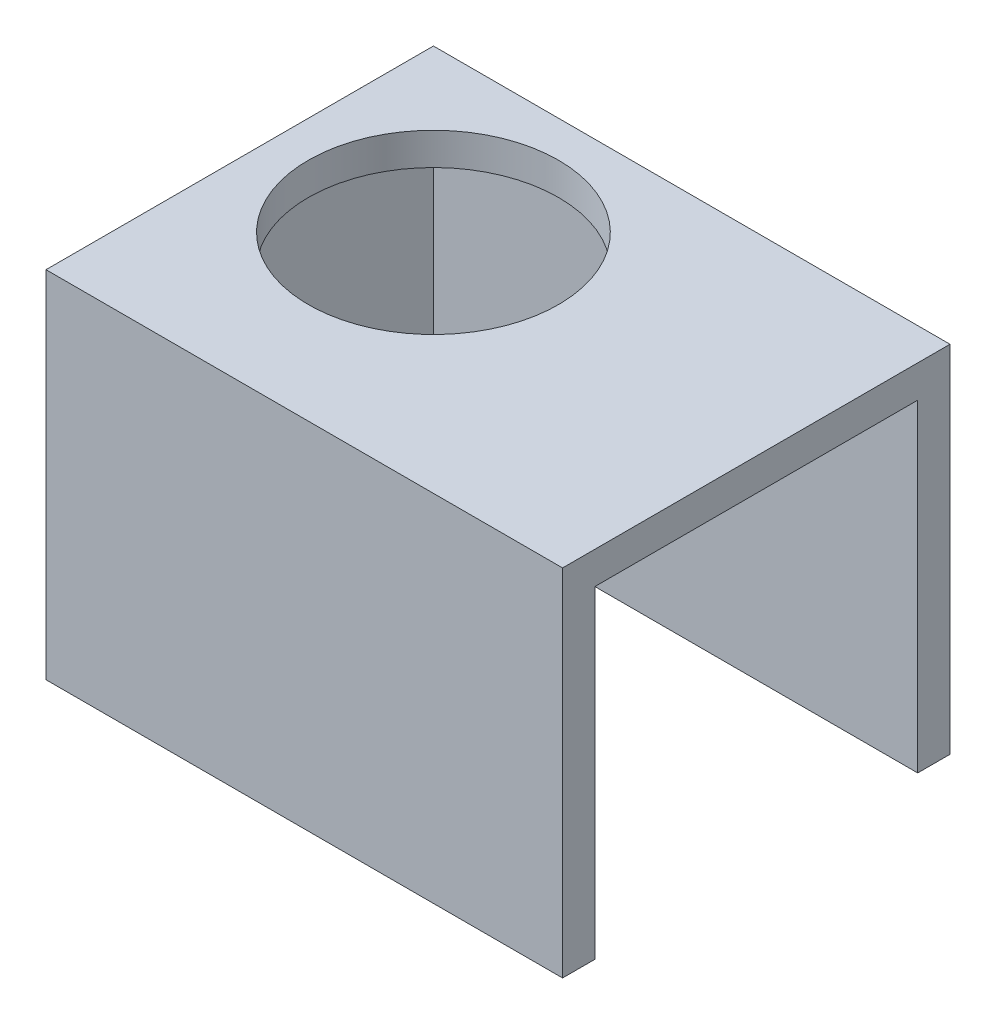
ISO-10303-21;
HEADER;
FILE_DESCRIPTION(('STEP AP214'),'2;1');
FILE_NAME('part.step','',(''),(''),'','','');
FILE_SCHEMA(('AUTOMOTIVE_DESIGN { 1 0 10303 214 1 1 1 1 }'));
ENDSEC;
DATA;
#1=APPLICATION_CONTEXT('core data for automotive mechanical design processes');
#2=APPLICATION_PROTOCOL_DEFINITION('international standard','automotive_design',2000,#1);
#3=PRODUCT_CONTEXT('',#1,'mechanical');
#4=PRODUCT('Part','Part','',(#3));
#5=PRODUCT_RELATED_PRODUCT_CATEGORY('part','',(#4));
#6=PRODUCT_DEFINITION_FORMATION('','',#4);
#7=PRODUCT_DEFINITION_CONTEXT('part definition',#1,'design');
#8=PRODUCT_DEFINITION('design','',#6,#7);
#9=PRODUCT_DEFINITION_SHAPE('','',#8);
#10=(LENGTH_UNIT() NAMED_UNIT(*) SI_UNIT(.MILLI.,.METRE.));
#11=(NAMED_UNIT(*) PLANE_ANGLE_UNIT() SI_UNIT($,.RADIAN.));
#12=(NAMED_UNIT(*) SI_UNIT($,.STERADIAN.) SOLID_ANGLE_UNIT());
#13=UNCERTAINTY_MEASURE_WITH_UNIT(LENGTH_MEASURE(1.E-05),#10,'distance_accuracy_value','');
#14=(GEOMETRIC_REPRESENTATION_CONTEXT(3) GLOBAL_UNCERTAINTY_ASSIGNED_CONTEXT((#13)) GLOBAL_UNIT_ASSIGNED_CONTEXT((#10,
#11,#12)) REPRESENTATION_CONTEXT('',''));
#15=CARTESIAN_POINT('',(0.,0.,0.));
#16=DIRECTION('',(0.,0.,1.));
#17=DIRECTION('',(1.,0.,0.));
#18=AXIS2_PLACEMENT_3D('',#15,#16,#17);
#19=CARTESIAN_POINT('',(16.,24.,12.));
#20=DIRECTION('',(-1.,0.,0.));
#21=DIRECTION('',(0.,0.,1.));
#22=AXIS2_PLACEMENT_3D('',#19,#20,#21);
#23=PLANE('',#22);
#24=DIRECTION('',(0.,0.,1.));
#25=VECTOR('',#24,1.);
#26=CARTESIAN_POINT('',(16.,2.,12.));
#27=LINE('',#26,#25);
#28=CARTESIAN_POINT('',(16.,2.,-12.));
#29=VERTEX_POINT('',#28);
#30=CARTESIAN_POINT('',(16.,2.,-10.));
#31=VERTEX_POINT('',#30);
#32=EDGE_CURVE('E113',#29,#31,#27,.T.);
#33=ORIENTED_EDGE('',*,*,#32,.F.);
#34=DIRECTION('',(0.,-1.,0.));
#35=VECTOR('',#34,1.);
#36=CARTESIAN_POINT('',(16.,24.,-12.));
#37=LINE('',#36,#35);
#38=CARTESIAN_POINT('',(16.,24.,-12.));
#39=VERTEX_POINT('',#38);
#40=EDGE_CURVE('E11',#39,#29,#37,.T.);
#41=ORIENTED_EDGE('',*,*,#40,.F.);
#42=DIRECTION('',(0.,0.,-1.));
#43=VECTOR('',#42,1.);
#44=CARTESIAN_POINT('',(16.,24.,12.));
#45=LINE('',#44,#43);
#46=CARTESIAN_POINT('',(16.,24.,12.));
#47=VERTEX_POINT('',#46);
#48=EDGE_CURVE('E126',#47,#39,#45,.T.);
#49=ORIENTED_EDGE('',*,*,#48,.F.);
#50=DIRECTION('',(0.,-1.,0.));
#51=VECTOR('',#50,1.);
#52=CARTESIAN_POINT('',(16.,24.,12.));
#53=LINE('',#52,#51);
#54=CARTESIAN_POINT('',(16.,2.,12.));
#55=VERTEX_POINT('',#54);
#56=EDGE_CURVE('E118',#47,#55,#53,.T.);
#57=ORIENTED_EDGE('',*,*,#56,.T.);
#58=CARTESIAN_POINT('',(16.,2.,10.));
#59=VERTEX_POINT('',#58);
#60=EDGE_CURVE('E102',#59,#55,#27,.T.);
#61=ORIENTED_EDGE('',*,*,#60,.F.);
#62=DIRECTION('',(0.,-1.,0.));
#63=VECTOR('',#62,1.);
#64=CARTESIAN_POINT('',(16.,24.,10.));
#65=LINE('',#64,#63);
#66=CARTESIAN_POINT('',(16.,22.,10.));
#67=VERTEX_POINT('',#66);
#68=EDGE_CURVE('E165',#67,#59,#65,.T.);
#69=ORIENTED_EDGE('',*,*,#68,.F.);
#70=DIRECTION('',(0.,0.,-1.));
#71=VECTOR('',#70,1.);
#72=CARTESIAN_POINT('',(16.,22.,0.));
#73=LINE('',#72,#71);
#74=CARTESIAN_POINT('',(16.,22.,-10.));
#75=VERTEX_POINT('',#74);
#76=EDGE_CURVE('E51',#67,#75,#73,.T.);
#77=ORIENTED_EDGE('',*,*,#76,.T.);
#78=DIRECTION('',(0.,-1.,0.));
#79=VECTOR('',#78,1.);
#80=CARTESIAN_POINT('',(16.,24.,-10.));
#81=LINE('',#80,#79);
#82=EDGE_CURVE('E157',#75,#31,#81,.T.);
#83=ORIENTED_EDGE('',*,*,#82,.T.);
#84=EDGE_LOOP('',(#33,#41,#49,#57,#61,#69,#77,#83));
#85=FACE_BOUND('',#84,.T.);
#86=ADVANCED_FACE('F37',(#85),#23,.F.);
#87=CARTESIAN_POINT('',(-16.,24.,-12.));
#88=DIRECTION('',(0.,0.,1.));
#89=DIRECTION('',(1.,0.,0.));
#90=AXIS2_PLACEMENT_3D('',#87,#88,#89);
#91=PLANE('',#90);
#92=DIRECTION('',(1.,0.,0.));
#93=VECTOR('',#92,1.);
#94=CARTESIAN_POINT('',(-16.,2.,-12.));
#95=LINE('',#94,#93);
#96=CARTESIAN_POINT('',(-16.,2.,-12.));
#97=VERTEX_POINT('',#96);
#98=EDGE_CURVE('E141',#97,#29,#95,.T.);
#99=ORIENTED_EDGE('',*,*,#98,.F.);
#100=DIRECTION('',(0.,-1.,0.));
#101=VECTOR('',#100,1.);
#102=CARTESIAN_POINT('',(-16.,24.,-12.));
#103=LINE('',#102,#101);
#104=CARTESIAN_POINT('',(-16.,24.,-12.));
#105=VERTEX_POINT('',#104);
#106=EDGE_CURVE('E44',#105,#97,#103,.T.);
#107=ORIENTED_EDGE('',*,*,#106,.F.);
#108=DIRECTION('',(-1.,0.,0.));
#109=VECTOR('',#108,1.);
#110=CARTESIAN_POINT('',(-16.,24.,-12.));
#111=LINE('',#110,#109);
#112=EDGE_CURVE('E140',#39,#105,#111,.T.);
#113=ORIENTED_EDGE('',*,*,#112,.F.);
#114=ORIENTED_EDGE('',*,*,#40,.T.);
#115=EDGE_LOOP('',(#99,#107,#113,#114));
#116=FACE_BOUND('',#115,.T.);
#117=ADVANCED_FACE('F139',(#116),#91,.F.);
#118=CARTESIAN_POINT('',(-16.,24.,12.));
#119=DIRECTION('',(1.,0.,0.));
#120=DIRECTION('',(0.,0.,-1.));
#121=AXIS2_PLACEMENT_3D('',#118,#119,#120);
#122=PLANE('',#121);
#123=DIRECTION('',(0.,0.,-1.));
#124=VECTOR('',#123,1.);
#125=CARTESIAN_POINT('',(-16.,2.,12.));
#126=LINE('',#125,#124);
#127=CARTESIAN_POINT('',(-16.,2.,12.));
#128=VERTEX_POINT('',#127);
#129=EDGE_CURVE('E122',#128,#97,#126,.T.);
#130=ORIENTED_EDGE('',*,*,#129,.F.);
#131=DIRECTION('',(0.,-1.,0.));
#132=VECTOR('',#131,1.);
#133=CARTESIAN_POINT('',(-16.,24.,12.));
#134=LINE('',#133,#132);
#135=CARTESIAN_POINT('',(-16.,24.,12.));
#136=VERTEX_POINT('',#135);
#137=EDGE_CURVE('E121',#136,#128,#134,.T.);
#138=ORIENTED_EDGE('',*,*,#137,.F.);
#139=DIRECTION('',(0.,0.,1.));
#140=VECTOR('',#139,1.);
#141=CARTESIAN_POINT('',(-16.,24.,12.));
#142=LINE('',#141,#140);
#143=EDGE_CURVE('E129',#105,#136,#142,.T.);
#144=ORIENTED_EDGE('',*,*,#143,.F.);
#145=ORIENTED_EDGE('',*,*,#106,.T.);
#146=EDGE_LOOP('',(#130,#138,#144,#145));
#147=FACE_BOUND('',#146,.T.);
#148=ADVANCED_FACE('F136',(#147),#122,.F.);
#149=CARTESIAN_POINT('',(-16.,24.,12.));
#150=DIRECTION('',(0.,0.,-1.));
#151=DIRECTION('',(-1.,0.,0.));
#152=AXIS2_PLACEMENT_3D('',#149,#150,#151);
#153=PLANE('',#152);
#154=DIRECTION('',(-1.,0.,0.));
#155=VECTOR('',#154,1.);
#156=CARTESIAN_POINT('',(-16.,2.,12.));
#157=LINE('',#156,#155);
#158=EDGE_CURVE('E105',#55,#128,#157,.T.);
#159=ORIENTED_EDGE('',*,*,#158,.F.);
#160=ORIENTED_EDGE('',*,*,#56,.F.);
#161=DIRECTION('',(1.,0.,0.));
#162=VECTOR('',#161,1.);
#163=CARTESIAN_POINT('',(-16.,24.,12.));
#164=LINE('',#163,#162);
#165=EDGE_CURVE('E59',#136,#47,#164,.T.);
#166=ORIENTED_EDGE('',*,*,#165,.F.);
#167=ORIENTED_EDGE('',*,*,#137,.T.);
#168=EDGE_LOOP('',(#159,#160,#166,#167));
#169=FACE_BOUND('',#168,.T.);
#170=ADVANCED_FACE('F117',(#169),#153,.F.);
#171=CARTESIAN_POINT('',(0.,24.,0.));
#172=DIRECTION('',(0.,-1.,0.));
#173=DIRECTION('',(0.,0.,-1.));
#174=AXIS2_PLACEMENT_3D('',#171,#172,#173);
#175=PLANE('',#174);
#176=CARTESIAN_POINT('',(-6.,24.,-2.));
#177=DIRECTION('',(0.,-1.,0.));
#178=DIRECTION('',(0.,0.,-1.));
#179=AXIS2_PLACEMENT_3D('',#176,#177,#178);
#180=CIRCLE('',#179,7.75000000000001);
#181=CARTESIAN_POINT('',(-6.,24.,-9.75000000000001));
#182=VERTEX_POINT('',#181);
#183=EDGE_CURVE('E145',#182,#182,#180,.T.);
#184=ORIENTED_EDGE('',*,*,#183,.T.);
#185=EDGE_LOOP('',(#184));
#186=FACE_BOUND('',#185,.T.);
#187=ORIENTED_EDGE('',*,*,#48,.T.);
#188=ORIENTED_EDGE('',*,*,#112,.T.);
#189=ORIENTED_EDGE('',*,*,#143,.T.);
#190=ORIENTED_EDGE('',*,*,#165,.T.);
#191=EDGE_LOOP('',(#187,#188,#189,#190));
#192=FACE_BOUND('',#191,.T.);
#193=ADVANCED_FACE('F175',(#186,#192),#175,.F.);
#194=CARTESIAN_POINT('',(-16.,24.,-10.));
#195=DIRECTION('',(0.,0.,1.));
#196=DIRECTION('',(1.,0.,0.));
#197=AXIS2_PLACEMENT_3D('',#194,#195,#196);
#198=PLANE('',#197);
#199=DIRECTION('',(-1.,0.,0.));
#200=VECTOR('',#199,1.);
#201=CARTESIAN_POINT('',(0.,2.,-10.));
#202=LINE('',#201,#200);
#203=CARTESIAN_POINT('',(-14.,2.,-10.));
#204=VERTEX_POINT('',#203);
#205=EDGE_CURVE('E151',#31,#204,#202,.T.);
#206=ORIENTED_EDGE('',*,*,#205,.F.);
#207=ORIENTED_EDGE('',*,*,#82,.F.);
#208=DIRECTION('',(-1.,0.,0.));
#209=VECTOR('',#208,1.);
#210=CARTESIAN_POINT('',(0.,22.,-10.));
#211=LINE('',#210,#209);
#212=CARTESIAN_POINT('',(-14.,22.,-10.));
#213=VERTEX_POINT('',#212);
#214=EDGE_CURVE('E159',#75,#213,#211,.T.);
#215=ORIENTED_EDGE('',*,*,#214,.T.);
#216=DIRECTION('',(0.,-1.,0.));
#217=VECTOR('',#216,1.);
#218=CARTESIAN_POINT('',(-14.,24.,-10.));
#219=LINE('',#218,#217);
#220=EDGE_CURVE('E154',#213,#204,#219,.T.);
#221=ORIENTED_EDGE('',*,*,#220,.T.);
#222=EDGE_LOOP('',(#206,#207,#215,#221));
#223=FACE_BOUND('',#222,.T.);
#224=ADVANCED_FACE('F179',(#223),#198,.T.);
#225=CARTESIAN_POINT('',(-14.,24.,12.));
#226=DIRECTION('',(1.,0.,0.));
#227=DIRECTION('',(0.,0.,-1.));
#228=AXIS2_PLACEMENT_3D('',#225,#226,#227);
#229=PLANE('',#228);
#230=DIRECTION('',(0.,0.,1.));
#231=VECTOR('',#230,1.);
#232=CARTESIAN_POINT('',(-14.,2.,0.));
#233=LINE('',#232,#231);
#234=CARTESIAN_POINT('',(-14.,2.,10.));
#235=VERTEX_POINT('',#234);
#236=EDGE_CURVE('E153',#204,#235,#233,.T.);
#237=ORIENTED_EDGE('',*,*,#236,.F.);
#238=ORIENTED_EDGE('',*,*,#220,.F.);
#239=DIRECTION('',(0.,0.,1.));
#240=VECTOR('',#239,1.);
#241=CARTESIAN_POINT('',(-14.,22.,0.));
#242=LINE('',#241,#240);
#243=CARTESIAN_POINT('',(-14.,22.,10.));
#244=VERTEX_POINT('',#243);
#245=EDGE_CURVE('E161',#213,#244,#242,.T.);
#246=ORIENTED_EDGE('',*,*,#245,.T.);
#247=DIRECTION('',(0.,-1.,0.));
#248=VECTOR('',#247,1.);
#249=CARTESIAN_POINT('',(-14.,24.,10.));
#250=LINE('',#249,#248);
#251=EDGE_CURVE('E158',#244,#235,#250,.T.);
#252=ORIENTED_EDGE('',*,*,#251,.T.);
#253=EDGE_LOOP('',(#237,#238,#246,#252));
#254=FACE_BOUND('',#253,.T.);
#255=ADVANCED_FACE('F184',(#254),#229,.T.);
#256=CARTESIAN_POINT('',(-16.,24.,10.));
#257=DIRECTION('',(0.,0.,-1.));
#258=DIRECTION('',(-1.,0.,0.));
#259=AXIS2_PLACEMENT_3D('',#256,#257,#258);
#260=PLANE('',#259);
#261=DIRECTION('',(1.,0.,0.));
#262=VECTOR('',#261,1.);
#263=CARTESIAN_POINT('',(0.,2.,10.));
#264=LINE('',#263,#262);
#265=EDGE_CURVE('E108',#235,#59,#264,.T.);
#266=ORIENTED_EDGE('',*,*,#265,.F.);
#267=ORIENTED_EDGE('',*,*,#251,.F.);
#268=DIRECTION('',(1.,0.,0.));
#269=VECTOR('',#268,1.);
#270=CARTESIAN_POINT('',(0.,22.,10.));
#271=LINE('',#270,#269);
#272=EDGE_CURVE('E167',#244,#67,#271,.T.);
#273=ORIENTED_EDGE('',*,*,#272,.T.);
#274=ORIENTED_EDGE('',*,*,#68,.T.);
#275=EDGE_LOOP('',(#266,#267,#273,#274));
#276=FACE_BOUND('',#275,.T.);
#277=ADVANCED_FACE('F187',(#276),#260,.T.);
#278=CARTESIAN_POINT('',(0.,22.,0.));
#279=DIRECTION('',(0.,-1.,0.));
#280=DIRECTION('',(0.,0.,-1.));
#281=AXIS2_PLACEMENT_3D('',#278,#279,#280);
#282=PLANE('',#281);
#283=CARTESIAN_POINT('',(-6.,22.,-2.));
#284=DIRECTION('',(0.,-1.,0.));
#285=DIRECTION('',(0.,0.,-1.));
#286=AXIS2_PLACEMENT_3D('',#283,#284,#285);
#287=CIRCLE('',#286,7.75000000000001);
#288=CARTESIAN_POINT('',(-6.,22.,-9.75000000000001));
#289=VERTEX_POINT('',#288);
#290=EDGE_CURVE('E142',#289,#289,#287,.T.);
#291=ORIENTED_EDGE('',*,*,#290,.F.);
#292=EDGE_LOOP('',(#291));
#293=FACE_BOUND('',#292,.T.);
#294=ORIENTED_EDGE('',*,*,#76,.F.);
#295=ORIENTED_EDGE('',*,*,#272,.F.);
#296=ORIENTED_EDGE('',*,*,#245,.F.);
#297=ORIENTED_EDGE('',*,*,#214,.F.);
#298=EDGE_LOOP('',(#294,#295,#296,#297));
#299=FACE_BOUND('',#298,.T.);
#300=ADVANCED_FACE('F188',(#293,#299),#282,.T.);
#301=CARTESIAN_POINT('',(-6.,27.,-2.));
#302=DIRECTION('',(0.,-1.,0.));
#303=DIRECTION('',(0.,0.,-1.));
#304=AXIS2_PLACEMENT_3D('',#301,#302,#303);
#305=CYLINDRICAL_SURFACE('',#304,7.75000000000001);
#306=ORIENTED_EDGE('',*,*,#290,.T.);
#307=EDGE_LOOP('',(#306));
#308=FACE_BOUND('',#307,.T.);
#309=ORIENTED_EDGE('',*,*,#183,.F.);
#310=EDGE_LOOP('',(#309));
#311=FACE_BOUND('',#310,.T.);
#312=ADVANCED_FACE('F190',(#308,#311),#305,.F.);
#313=CARTESIAN_POINT('',(0.,2.,0.));
#314=DIRECTION('',(0.,-1.,0.));
#315=DIRECTION('',(0.,0.,-1.));
#316=AXIS2_PLACEMENT_3D('',#313,#314,#315);
#317=PLANE('',#316);
#318=ORIENTED_EDGE('',*,*,#236,.T.);
#319=ORIENTED_EDGE('',*,*,#265,.T.);
#320=ORIENTED_EDGE('',*,*,#60,.T.);
#321=ORIENTED_EDGE('',*,*,#158,.T.);
#322=ORIENTED_EDGE('',*,*,#129,.T.);
#323=ORIENTED_EDGE('',*,*,#98,.T.);
#324=ORIENTED_EDGE('',*,*,#32,.T.);
#325=ORIENTED_EDGE('',*,*,#205,.T.);
#326=EDGE_LOOP('',(#318,#319,#320,#321,#322,#323,#324,#325));
#327=FACE_BOUND('',#326,.T.);
#328=ADVANCED_FACE('F104',(#327),#317,.T.);
#329=CLOSED_SHELL('',(#86,#117,#148,#170,#193,#224,#255,#277,#300,#312,#328));
#330=MANIFOLD_SOLID_BREP('B2',#329);
#331=ADVANCED_BREP_SHAPE_REPRESENTATION('',(#18,#330),#14);
#332=SHAPE_DEFINITION_REPRESENTATION(#9,#331);
ENDSEC;
END-ISO-10303-21;
